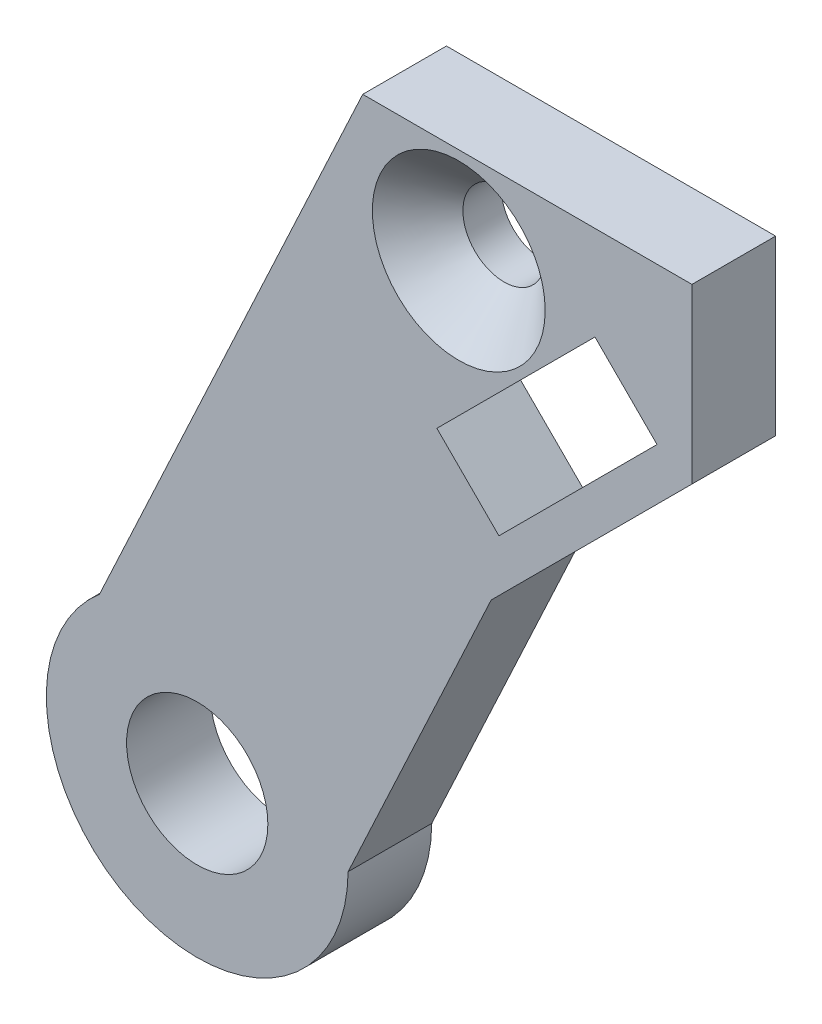
ISO-10303-21;
HEADER;
FILE_DESCRIPTION(('STEP AP214'),'2;1');
FILE_NAME('part.step','',(''),(''),'','','');
FILE_SCHEMA(('AUTOMOTIVE_DESIGN { 1 0 10303 214 1 1 1 1 }'));
ENDSEC;
DATA;
#1=APPLICATION_CONTEXT('core data for automotive mechanical design processes');
#2=APPLICATION_PROTOCOL_DEFINITION('international standard','automotive_design',2000,#1);
#3=PRODUCT_CONTEXT('',#1,'mechanical');
#4=PRODUCT('Part','Part','',(#3));
#5=PRODUCT_RELATED_PRODUCT_CATEGORY('part','',(#4));
#6=PRODUCT_DEFINITION_FORMATION('','',#4);
#7=PRODUCT_DEFINITION_CONTEXT('part definition',#1,'design');
#8=PRODUCT_DEFINITION('design','',#6,#7);
#9=PRODUCT_DEFINITION_SHAPE('','',#8);
#10=(LENGTH_UNIT() NAMED_UNIT(*) SI_UNIT(.MILLI.,.METRE.));
#11=(NAMED_UNIT(*) PLANE_ANGLE_UNIT() SI_UNIT($,.RADIAN.));
#12=(NAMED_UNIT(*) SI_UNIT($,.STERADIAN.) SOLID_ANGLE_UNIT());
#13=UNCERTAINTY_MEASURE_WITH_UNIT(LENGTH_MEASURE(1.E-05),#10,'distance_accuracy_value','');
#14=(GEOMETRIC_REPRESENTATION_CONTEXT(3) GLOBAL_UNCERTAINTY_ASSIGNED_CONTEXT((#13)) GLOBAL_UNIT_ASSIGNED_CONTEXT((#10,
#11,#12)) REPRESENTATION_CONTEXT('',''));
#15=CARTESIAN_POINT('',(0.,0.,0.));
#16=DIRECTION('',(0.,0.,1.));
#17=DIRECTION('',(1.,0.,0.));
#18=AXIS2_PLACEMENT_3D('',#15,#16,#17);
#19=CARTESIAN_POINT('',(3.5,-3.5,3.05));
#20=DIRECTION('',(0.,0.,-1.));
#21=DIRECTION('',(-1.,0.,0.));
#22=AXIS2_PLACEMENT_3D('',#19,#20,#21);
#23=CYLINDRICAL_SURFACE('',#22,1.5);
#24=CARTESIAN_POINT('',(3.5,-3.5,0.));
#25=DIRECTION('',(0.,0.,-1.));
#26=DIRECTION('',(1.,0.,0.));
#27=AXIS2_PLACEMENT_3D('',#24,#25,#26);
#28=CIRCLE('',#27,1.5);
#29=CARTESIAN_POINT('',(5.,-3.5,0.));
#30=VERTEX_POINT('',#29);
#31=EDGE_CURVE('E164',#30,#30,#28,.T.);
#32=ORIENTED_EDGE('',*,*,#31,.T.);
#33=EDGE_LOOP('',(#32));
#34=FACE_BOUND('',#33,.T.);
#35=CARTESIAN_POINT('',(3.5,-3.5,1.4));
#36=DIRECTION('',(0.,0.,-1.));
#37=DIRECTION('',(1.,0.,0.));
#38=AXIS2_PLACEMENT_3D('',#35,#36,#37);
#39=CIRCLE('',#38,1.5);
#40=CARTESIAN_POINT('',(5.,-3.5,1.4));
#41=VERTEX_POINT('',#40);
#42=EDGE_CURVE('E11',#41,#41,#39,.T.);
#43=ORIENTED_EDGE('',*,*,#42,.F.);
#44=EDGE_LOOP('',(#43));
#45=FACE_BOUND('',#44,.T.);
#46=ADVANCED_FACE('F47',(#34,#45),#23,.F.);
#47=CARTESIAN_POINT('',(8.20970869120796,-8.20970869120796,3.05));
#48=DIRECTION('',(0.707106781186548,-0.707106781186547,0.));
#49=DIRECTION('',(-0.707106781186547,-0.707106781186548,0.));
#50=AXIS2_PLACEMENT_3D('',#47,#48,#49);
#51=PLANE('',#50);
#52=DIRECTION('',(0.707106781186547,0.707106781186548,0.));
#53=VECTOR('',#52,1.);
#54=CARTESIAN_POINT('',(8.20970869120796,-8.20970869120796,0.));
#55=LINE('',#54,#53);
#56=CARTESIAN_POINT('',(4.96428752719385,-11.4551298552221,0.));
#57=VERTEX_POINT('',#56);
#58=CARTESIAN_POINT('',(10.7272077938642,-5.6922095885517,0.));
#59=VERTEX_POINT('',#58);
#60=EDGE_CURVE('E194',#57,#59,#55,.T.);
#61=ORIENTED_EDGE('',*,*,#60,.F.);
#62=DIRECTION('',(0.,0.,-1.));
#63=VECTOR('',#62,1.);
#64=CARTESIAN_POINT('',(4.96428752719385,-11.4551298552221,3.05));
#65=LINE('',#64,#63);
#66=CARTESIAN_POINT('',(4.96428752719385,-11.4551298552221,3.05));
#67=VERTEX_POINT('',#66);
#68=EDGE_CURVE('E205',#67,#57,#65,.T.);
#69=ORIENTED_EDGE('',*,*,#68,.F.);
#70=DIRECTION('',(0.707106781186547,0.707106781186548,0.));
#71=VECTOR('',#70,1.);
#72=CARTESIAN_POINT('',(8.20970869120796,-8.20970869120796,3.05));
#73=LINE('',#72,#71);
#74=CARTESIAN_POINT('',(10.7272077938642,-5.6922095885517,3.05));
#75=VERTEX_POINT('',#74);
#76=EDGE_CURVE('E154',#67,#75,#73,.T.);
#77=ORIENTED_EDGE('',*,*,#76,.T.);
#78=DIRECTION('',(0.,0.,-1.));
#79=VECTOR('',#78,1.);
#80=CARTESIAN_POINT('',(10.7272077938642,-5.6922095885517,3.05));
#81=LINE('',#80,#79);
#82=EDGE_CURVE('E57',#75,#59,#81,.T.);
#83=ORIENTED_EDGE('',*,*,#82,.T.);
#84=EDGE_LOOP('',(#61,#69,#77,#83));
#85=FACE_BOUND('',#84,.T.);
#86=ADVANCED_FACE('F283',(#85),#51,.F.);
#87=CARTESIAN_POINT('',(2.51749910265625,2.51749910265625,3.05));
#88=DIRECTION('',(-0.707106781186548,-0.707106781186548,0.));
#89=DIRECTION('',(-0.707106781186548,0.707106781186548,0.));
#90=AXIS2_PLACEMENT_3D('',#87,#88,#89);
#91=PLANE('',#90);
#92=DIRECTION('',(0.707106781186548,-0.707106781186548,0.));
#93=VECTOR('',#92,1.);
#94=CARTESIAN_POINT('',(2.51749910265625,2.51749910265625,0.));
#95=LINE('',#94,#93);
#96=CARTESIAN_POINT('',(8.46446609406726,-3.42946788875475,0.));
#97=VERTEX_POINT('',#96);
#98=EDGE_CURVE('E197',#97,#59,#95,.T.);
#99=ORIENTED_EDGE('',*,*,#98,.T.);
#100=ORIENTED_EDGE('',*,*,#82,.F.);
#101=DIRECTION('',(0.707106781186548,-0.707106781186548,0.));
#102=VECTOR('',#101,1.);
#103=CARTESIAN_POINT('',(2.51749910265625,2.51749910265625,3.05));
#104=LINE('',#103,#102);
#105=CARTESIAN_POINT('',(8.46446609406726,-3.42946788875475,3.05));
#106=VERTEX_POINT('',#105);
#107=EDGE_CURVE('E136',#106,#75,#104,.T.);
#108=ORIENTED_EDGE('',*,*,#107,.F.);
#109=DIRECTION('',(0.,0.,-1.));
#110=VECTOR('',#109,1.);
#111=CARTESIAN_POINT('',(8.46446609406726,-3.42946788875475,3.05));
#112=LINE('',#111,#110);
#113=EDGE_CURVE('E142',#106,#97,#112,.T.);
#114=ORIENTED_EDGE('',*,*,#113,.T.);
#115=EDGE_LOOP('',(#99,#100,#108,#114));
#116=FACE_BOUND('',#115,.T.);
#117=ADVANCED_FACE('F150',(#116),#91,.T.);
#118=CARTESIAN_POINT('',(5.94696699141101,-5.94696699141101,3.05));
#119=DIRECTION('',(-0.707106781186547,0.707106781186548,0.));
#120=DIRECTION('',(0.707106781186548,0.707106781186547,0.));
#121=AXIS2_PLACEMENT_3D('',#118,#119,#120);
#122=PLANE('',#121);
#123=DIRECTION('',(-0.707106781186548,-0.707106781186547,0.));
#124=VECTOR('',#123,1.);
#125=CARTESIAN_POINT('',(5.94696699141101,-5.94696699141101,0.));
#126=LINE('',#125,#124);
#127=CARTESIAN_POINT('',(2.7015458273969,-9.19238815542512,0.));
#128=VERTEX_POINT('',#127);
#129=EDGE_CURVE('E144',#97,#128,#126,.T.);
#130=ORIENTED_EDGE('',*,*,#129,.F.);
#131=ORIENTED_EDGE('',*,*,#113,.F.);
#132=DIRECTION('',(-0.707106781186548,-0.707106781186547,0.));
#133=VECTOR('',#132,1.);
#134=CARTESIAN_POINT('',(5.94696699141101,-5.94696699141101,3.05));
#135=LINE('',#134,#133);
#136=CARTESIAN_POINT('',(2.7015458273969,-9.19238815542512,3.05));
#137=VERTEX_POINT('',#136);
#138=EDGE_CURVE('E132',#106,#137,#135,.T.);
#139=ORIENTED_EDGE('',*,*,#138,.T.);
#140=DIRECTION('',(0.,0.,-1.));
#141=VECTOR('',#140,1.);
#142=CARTESIAN_POINT('',(2.7015458273969,-9.19238815542512,3.05));
#143=LINE('',#142,#141);
#144=EDGE_CURVE('E148',#137,#128,#143,.T.);
#145=ORIENTED_EDGE('',*,*,#144,.T.);
#146=EDGE_LOOP('',(#130,#131,#139,#145));
#147=FACE_BOUND('',#146,.T.);
#148=ADVANCED_FACE('F143',(#147),#122,.F.);
#149=CARTESIAN_POINT('',(0.,0.,3.05));
#150=DIRECTION('',(-0.906307787036648,0.422618261740703,0.));
#151=DIRECTION('',(0.422618261740703,0.906307787036648,0.));
#152=AXIS2_PLACEMENT_3D('',#149,#150,#151);
#153=PLANE('',#152);
#154=DIRECTION('',(-0.422618261740703,-0.906307787036648,0.));
#155=VECTOR('',#154,1.);
#156=CARTESIAN_POINT('',(0.,0.,0.));
#157=LINE('',#156,#155);
#158=CARTESIAN_POINT('',(0.,0.,0.));
#159=VERTEX_POINT('',#158);
#160=CARTESIAN_POINT('',(-9.59711645626916,-20.5810826574052,0.));
#161=VERTEX_POINT('',#160);
#162=EDGE_CURVE('E168',#159,#161,#157,.T.);
#163=ORIENTED_EDGE('',*,*,#162,.T.);
#164=DIRECTION('',(0.,0.,-1.));
#165=VECTOR('',#164,1.);
#166=CARTESIAN_POINT('',(-9.59711645626916,-20.5810826574052,3.05));
#167=LINE('',#166,#165);
#168=CARTESIAN_POINT('',(-9.59711645626916,-20.5810826574052,3.05));
#169=VERTEX_POINT('',#168);
#170=EDGE_CURVE('E163',#169,#161,#167,.T.);
#171=ORIENTED_EDGE('',*,*,#170,.F.);
#172=DIRECTION('',(-0.422618261740703,-0.906307787036648,0.));
#173=VECTOR('',#172,1.);
#174=CARTESIAN_POINT('',(0.,0.,3.05));
#175=LINE('',#174,#173);
#176=CARTESIAN_POINT('',(0.,0.,3.05));
#177=VERTEX_POINT('',#176);
#178=EDGE_CURVE('E204',#177,#169,#175,.T.);
#179=ORIENTED_EDGE('',*,*,#178,.F.);
#180=DIRECTION('',(0.,0.,-1.));
#181=VECTOR('',#180,1.);
#182=CARTESIAN_POINT('',(0.,0.,3.05));
#183=LINE('',#182,#181);
#184=EDGE_CURVE('E50',#177,#159,#183,.T.);
#185=ORIENTED_EDGE('',*,*,#184,.T.);
#186=EDGE_LOOP('',(#163,#171,#179,#185));
#187=FACE_BOUND('',#186,.T.);
#188=ADVANCED_FACE('F236',(#187),#153,.T.);
#189=CARTESIAN_POINT('',(0.,0.,3.05));
#190=DIRECTION('',(0.,-1.,0.));
#191=DIRECTION('',(0.,0.,1.));
#192=AXIS2_PLACEMENT_3D('',#189,#190,#191);
#193=PLANE('',#192);
#194=DIRECTION('',(1.,0.,0.));
#195=VECTOR('',#194,1.);
#196=CARTESIAN_POINT('',(0.,0.,0.));
#197=LINE('',#196,#195);
#198=CARTESIAN_POINT('',(12.,0.,0.));
#199=VERTEX_POINT('',#198);
#200=EDGE_CURVE('E173',#159,#199,#197,.T.);
#201=ORIENTED_EDGE('',*,*,#200,.F.);
#202=ORIENTED_EDGE('',*,*,#184,.F.);
#203=DIRECTION('',(1.,0.,0.));
#204=VECTOR('',#203,1.);
#205=CARTESIAN_POINT('',(0.,0.,3.05));
#206=LINE('',#205,#204);
#207=CARTESIAN_POINT('',(12.,0.,3.05));
#208=VERTEX_POINT('',#207);
#209=EDGE_CURVE('E111',#177,#208,#206,.T.);
#210=ORIENTED_EDGE('',*,*,#209,.T.);
#211=DIRECTION('',(0.,0.,-1.));
#212=VECTOR('',#211,1.);
#213=CARTESIAN_POINT('',(12.,0.,3.05));
#214=LINE('',#213,#212);
#215=EDGE_CURVE('E226',#208,#199,#214,.T.);
#216=ORIENTED_EDGE('',*,*,#215,.T.);
#217=EDGE_LOOP('',(#201,#202,#210,#216));
#218=FACE_BOUND('',#217,.T.);
#219=ADVANCED_FACE('F374',(#218),#193,.F.);
#220=CARTESIAN_POINT('',(12.,0.,3.05));
#221=DIRECTION('',(-1.,0.,0.));
#222=DIRECTION('',(0.,0.,1.));
#223=AXIS2_PLACEMENT_3D('',#220,#221,#222);
#224=PLANE('',#223);
#225=DIRECTION('',(0.,-1.,0.));
#226=VECTOR('',#225,1.);
#227=CARTESIAN_POINT('',(12.,0.,0.));
#228=LINE('',#227,#226);
#229=CARTESIAN_POINT('',(12.,-6.3039086153561,0.));
#230=VERTEX_POINT('',#229);
#231=EDGE_CURVE('E177',#199,#230,#228,.T.);
#232=ORIENTED_EDGE('',*,*,#231,.F.);
#233=ORIENTED_EDGE('',*,*,#215,.F.);
#234=DIRECTION('',(0.,-1.,0.));
#235=VECTOR('',#234,1.);
#236=CARTESIAN_POINT('',(12.,0.,3.05));
#237=LINE('',#236,#235);
#238=CARTESIAN_POINT('',(12.,-6.3039086153561,3.05));
#239=VERTEX_POINT('',#238);
#240=EDGE_CURVE('E255',#208,#239,#237,.T.);
#241=ORIENTED_EDGE('',*,*,#240,.T.);
#242=DIRECTION('',(0.,0.,-1.));
#243=VECTOR('',#242,1.);
#244=CARTESIAN_POINT('',(12.,-6.3039086153561,3.05));
#245=LINE('',#244,#243);
#246=EDGE_CURVE('E223',#239,#230,#245,.T.);
#247=ORIENTED_EDGE('',*,*,#246,.T.);
#248=EDGE_LOOP('',(#232,#233,#241,#247));
#249=FACE_BOUND('',#248,.T.);
#250=ADVANCED_FACE('F363',(#249),#224,.F.);
#251=CARTESIAN_POINT('',(9.15195430767813,-9.15195430767801,3.05));
#252=DIRECTION('',(0.707106781186552,-0.707106781186543,0.));
#253=DIRECTION('',(-0.707106781186543,-0.707106781186552,0.));
#254=AXIS2_PLACEMENT_3D('',#251,#252,#253);
#255=PLANE('',#254);
#256=DIRECTION('',(0.707106781186543,0.707106781186552,0.));
#257=VECTOR('',#256,1.);
#258=CARTESIAN_POINT('',(9.15195430767813,-9.15195430767801,0.));
#259=LINE('',#258,#257);
#260=CARTESIAN_POINT('',(4.68158568563559,-13.6223229297206,0.));
#261=VERTEX_POINT('',#260);
#262=EDGE_CURVE('E181',#261,#230,#259,.T.);
#263=ORIENTED_EDGE('',*,*,#262,.T.);
#264=ORIENTED_EDGE('',*,*,#246,.F.);
#265=DIRECTION('',(0.707106781186543,0.707106781186552,0.));
#266=VECTOR('',#265,1.);
#267=CARTESIAN_POINT('',(9.15195430767813,-9.15195430767801,3.05));
#268=LINE('',#267,#266);
#269=CARTESIAN_POINT('',(4.68158568563559,-13.6223229297206,3.05));
#270=VERTEX_POINT('',#269);
#271=EDGE_CURVE('E262',#270,#239,#268,.T.);
#272=ORIENTED_EDGE('',*,*,#271,.F.);
#273=DIRECTION('',(0.,0.,-1.));
#274=VECTOR('',#273,1.);
#275=CARTESIAN_POINT('',(4.68158568563559,-13.6223229297206,3.05));
#276=LINE('',#275,#274);
#277=EDGE_CURVE('E219',#270,#261,#276,.T.);
#278=ORIENTED_EDGE('',*,*,#277,.T.);
#279=EDGE_LOOP('',(#263,#264,#272,#278));
#280=FACE_BOUND('',#279,.T.);
#281=ADVANCED_FACE('F352',(#280),#255,.T.);
#282=CARTESIAN_POINT('',(9.0630778703663,-4.22618261740677,3.05));
#283=DIRECTION('',(0.906307787036655,-0.422618261740689,0.));
#284=DIRECTION('',(-0.422618261740689,-0.906307787036655,0.));
#285=AXIS2_PLACEMENT_3D('',#282,#283,#284);
#286=PLANE('',#285);
#287=DIRECTION('',(0.422618261740689,0.906307787036655,0.));
#288=VECTOR('',#287,1.);
#289=CARTESIAN_POINT('',(9.0630778703663,-4.22618261740677,0.));
#290=LINE('',#289,#288);
#291=CARTESIAN_POINT('',(-0.534038585902411,-24.8072652748118,0.));
#292=VERTEX_POINT('',#291);
#293=EDGE_CURVE('E184',#292,#261,#290,.T.);
#294=ORIENTED_EDGE('',*,*,#293,.T.);
#295=ORIENTED_EDGE('',*,*,#277,.F.);
#296=DIRECTION('',(0.422618261740689,0.906307787036655,0.));
#297=VECTOR('',#296,1.);
#298=CARTESIAN_POINT('',(9.0630778703663,-4.22618261740677,3.05));
#299=LINE('',#298,#297);
#300=CARTESIAN_POINT('',(-0.534038585902411,-24.8072652748118,3.05));
#301=VERTEX_POINT('',#300);
#302=EDGE_CURVE('E249',#301,#270,#299,.T.);
#303=ORIENTED_EDGE('',*,*,#302,.F.);
#304=DIRECTION('',(0.,0.,-1.));
#305=VECTOR('',#304,1.);
#306=CARTESIAN_POINT('',(-0.534038585902411,-24.8072652748118,3.05));
#307=LINE('',#306,#305);
#308=EDGE_CURVE('E215',#301,#292,#307,.T.);
#309=ORIENTED_EDGE('',*,*,#308,.T.);
#310=EDGE_LOOP('',(#294,#295,#303,#309));
#311=FACE_BOUND('',#310,.T.);
#312=ADVANCED_FACE('F273',(#311),#286,.T.);
#313=CARTESIAN_POINT('',(-6.03391760833418,-24.7707859846198,3.05));
#314=DIRECTION('',(0.,0.,-1.));
#315=DIRECTION('',(-1.,0.,0.));
#316=AXIS2_PLACEMENT_3D('',#313,#314,#315);
#317=CYLINDRICAL_SURFACE('',#316,2.57499999999981);
#318=CARTESIAN_POINT('',(-6.03391760833418,-24.7707859846198,3.05));
#319=DIRECTION('',(0.,0.,-1.));
#320=DIRECTION('',(1.,0.,0.));
#321=AXIS2_PLACEMENT_3D('',#318,#319,#320);
#322=CIRCLE('',#321,2.57499999999981);
#323=CARTESIAN_POINT('',(-3.45891760833437,-24.7707859846198,3.05));
#324=VERTEX_POINT('',#323);
#325=EDGE_CURVE('E157',#324,#324,#322,.T.);
#326=ORIENTED_EDGE('',*,*,#325,.F.);
#327=EDGE_LOOP('',(#326));
#328=FACE_BOUND('',#327,.T.);
#329=CARTESIAN_POINT('',(-6.03391760833418,-24.7707859846198,0.));
#330=DIRECTION('',(0.,0.,-1.));
#331=DIRECTION('',(1.,0.,0.));
#332=AXIS2_PLACEMENT_3D('',#329,#330,#331);
#333=CIRCLE('',#332,2.57499999999981);
#334=CARTESIAN_POINT('',(-3.45891760833437,-24.7707859846198,0.));
#335=VERTEX_POINT('',#334);
#336=EDGE_CURVE('E190',#335,#335,#333,.T.);
#337=ORIENTED_EDGE('',*,*,#336,.T.);
#338=EDGE_LOOP('',(#337));
#339=FACE_BOUND('',#338,.T.);
#340=ADVANCED_FACE('F270',(#328,#339),#317,.F.);
#341=CARTESIAN_POINT('',(-6.03391760833418,-24.7707859846198,3.05));
#342=DIRECTION('',(0.,0.,-1.));
#343=DIRECTION('',(-1.,0.,0.));
#344=AXIS2_PLACEMENT_3D('',#341,#342,#343);
#345=CYLINDRICAL_SURFACE('',#344,5.49999999999981);
#346=CARTESIAN_POINT('',(-6.03391760833418,-24.7707859846198,0.));
#347=DIRECTION('',(0.,0.,-1.));
#348=DIRECTION('',(1.,0.,0.));
#349=AXIS2_PLACEMENT_3D('',#346,#347,#348);
#350=CIRCLE('',#349,5.49999999999981);
#351=EDGE_CURVE('E187',#292,#161,#350,.T.);
#352=ORIENTED_EDGE('',*,*,#351,.F.);
#353=ORIENTED_EDGE('',*,*,#308,.F.);
#354=CARTESIAN_POINT('',(-6.03391760833418,-24.7707859846198,3.05));
#355=DIRECTION('',(0.,0.,-1.));
#356=DIRECTION('',(1.,0.,0.));
#357=AXIS2_PLACEMENT_3D('',#354,#355,#356);
#358=CIRCLE('',#357,5.49999999999981);
#359=EDGE_CURVE('E246',#301,#169,#358,.T.);
#360=ORIENTED_EDGE('',*,*,#359,.T.);
#361=ORIENTED_EDGE('',*,*,#170,.T.);
#362=EDGE_LOOP('',(#352,#353,#360,#361));
#363=FACE_BOUND('',#362,.T.);
#364=ADVANCED_FACE('F245',(#363),#345,.T.);
#365=CARTESIAN_POINT('',(-3.24542116401411,-3.24542116401411,3.05));
#366=DIRECTION('',(-0.707106781186548,-0.707106781186547,0.));
#367=DIRECTION('',(-0.707106781186547,0.707106781186548,0.));
#368=AXIS2_PLACEMENT_3D('',#365,#366,#367);
#369=PLANE('',#368);
#370=DIRECTION('',(0.707106781186547,-0.707106781186548,0.));
#371=VECTOR('',#370,1.);
#372=CARTESIAN_POINT('',(-3.24542116401411,-3.24542116401411,0.));
#373=LINE('',#372,#371);
#374=EDGE_CURVE('E98',#128,#57,#373,.T.);
#375=ORIENTED_EDGE('',*,*,#374,.F.);
#376=ORIENTED_EDGE('',*,*,#144,.F.);
#377=DIRECTION('',(0.707106781186547,-0.707106781186548,0.));
#378=VECTOR('',#377,1.);
#379=CARTESIAN_POINT('',(-3.24542116401411,-3.24542116401411,3.05));
#380=LINE('',#379,#378);
#381=EDGE_CURVE('E66',#137,#67,#380,.T.);
#382=ORIENTED_EDGE('',*,*,#381,.T.);
#383=ORIENTED_EDGE('',*,*,#68,.T.);
#384=EDGE_LOOP('',(#375,#376,#382,#383));
#385=FACE_BOUND('',#384,.T.);
#386=ADVANCED_FACE('F284',(#385),#369,.F.);
#387=CARTESIAN_POINT('',(0.,0.,3.05));
#388=DIRECTION('',(0.,0.,1.));
#389=DIRECTION('',(1.,0.,0.));
#390=AXIS2_PLACEMENT_3D('',#387,#388,#389);
#391=PLANE('',#390);
#392=CARTESIAN_POINT('',(3.5,-3.5,3.05));
#393=DIRECTION('',(0.,0.,-1.));
#394=DIRECTION('',(1.,0.,0.));
#395=AXIS2_PLACEMENT_3D('',#392,#393,#394);
#396=CIRCLE('',#395,3.15);
#397=CARTESIAN_POINT('',(6.65,-3.5,3.05));
#398=VERTEX_POINT('',#397);
#399=EDGE_CURVE('E169',#398,#398,#396,.T.);
#400=ORIENTED_EDGE('',*,*,#399,.T.);
#401=EDGE_LOOP('',(#400));
#402=FACE_BOUND('',#401,.T.);
#403=ORIENTED_EDGE('',*,*,#178,.T.);
#404=ORIENTED_EDGE('',*,*,#359,.F.);
#405=ORIENTED_EDGE('',*,*,#302,.T.);
#406=ORIENTED_EDGE('',*,*,#271,.T.);
#407=ORIENTED_EDGE('',*,*,#240,.F.);
#408=ORIENTED_EDGE('',*,*,#209,.F.);
#409=EDGE_LOOP('',(#403,#404,#405,#406,#407,#408));
#410=FACE_BOUND('',#409,.T.);
#411=ORIENTED_EDGE('',*,*,#325,.T.);
#412=EDGE_LOOP('',(#411));
#413=FACE_BOUND('',#412,.T.);
#414=ORIENTED_EDGE('',*,*,#76,.F.);
#415=ORIENTED_EDGE('',*,*,#381,.F.);
#416=ORIENTED_EDGE('',*,*,#138,.F.);
#417=ORIENTED_EDGE('',*,*,#107,.T.);
#418=EDGE_LOOP('',(#414,#415,#416,#417));
#419=FACE_BOUND('',#418,.T.);
#420=ADVANCED_FACE('F134',(#402,#410,#413,#419),#391,.T.);
#421=CARTESIAN_POINT('',(0.,0.,0.));
#422=DIRECTION('',(0.,0.,1.));
#423=DIRECTION('',(1.,0.,0.));
#424=AXIS2_PLACEMENT_3D('',#421,#422,#423);
#425=PLANE('',#424);
#426=ORIENTED_EDGE('',*,*,#31,.F.);
#427=EDGE_LOOP('',(#426));
#428=FACE_BOUND('',#427,.T.);
#429=ORIENTED_EDGE('',*,*,#162,.F.);
#430=ORIENTED_EDGE('',*,*,#200,.T.);
#431=ORIENTED_EDGE('',*,*,#231,.T.);
#432=ORIENTED_EDGE('',*,*,#262,.F.);
#433=ORIENTED_EDGE('',*,*,#293,.F.);
#434=ORIENTED_EDGE('',*,*,#351,.T.);
#435=EDGE_LOOP('',(#429,#430,#431,#432,#433,#434));
#436=FACE_BOUND('',#435,.T.);
#437=ORIENTED_EDGE('',*,*,#336,.F.);
#438=EDGE_LOOP('',(#437));
#439=FACE_BOUND('',#438,.T.);
#440=ORIENTED_EDGE('',*,*,#60,.T.);
#441=ORIENTED_EDGE('',*,*,#98,.F.);
#442=ORIENTED_EDGE('',*,*,#129,.T.);
#443=ORIENTED_EDGE('',*,*,#374,.T.);
#444=EDGE_LOOP('',(#440,#441,#442,#443));
#445=FACE_BOUND('',#444,.T.);
#446=ADVANCED_FACE('F239',(#428,#436,#439,#445),#425,.F.);
#447=CARTESIAN_POINT('',(3.5,-3.5,3.05));
#448=DIRECTION('',(0.,0.,1.));
#449=DIRECTION('',(1.,0.,0.));
#450=AXIS2_PLACEMENT_3D('',#447,#448,#449);
#451=CONICAL_SURFACE('',#450,3.15,0.785398163397449);
#452=ORIENTED_EDGE('',*,*,#42,.T.);
#453=EDGE_LOOP('',(#452));
#454=FACE_BOUND('',#453,.T.);
#455=ORIENTED_EDGE('',*,*,#399,.F.);
#456=EDGE_LOOP('',(#455));
#457=FACE_BOUND('',#456,.T.);
#458=ADVANCED_FACE('F277',(#454,#457),#451,.F.);
#459=CLOSED_SHELL('',(#46,#86,#117,#148,#188,#219,#250,#281,#312,#340,#364,#386,#420,#446,#458));
#460=MANIFOLD_SOLID_BREP('B2',#459);
#461=ADVANCED_BREP_SHAPE_REPRESENTATION('',(#18,#460),#14);
#462=SHAPE_DEFINITION_REPRESENTATION(#9,#461);
ENDSEC;
END-ISO-10303-21;
